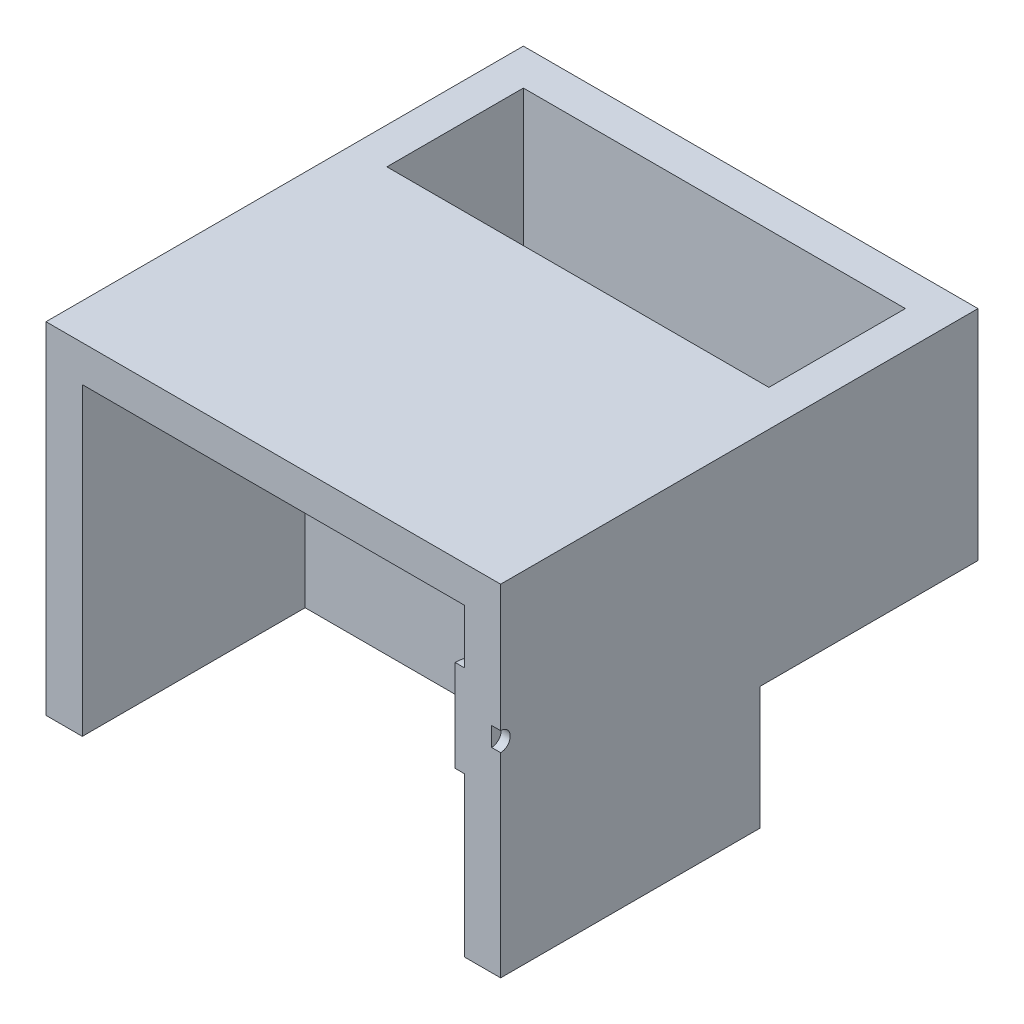
ISO-10303-21;
HEADER;
FILE_DESCRIPTION(('STEP AP214'),'2;1');
FILE_NAME('part.step','',(''),(''),'','','');
FILE_SCHEMA(('AUTOMOTIVE_DESIGN { 1 0 10303 214 1 1 1 1 }'));
ENDSEC;
DATA;
#1=APPLICATION_CONTEXT('core data for automotive mechanical design processes');
#2=APPLICATION_PROTOCOL_DEFINITION('international standard','automotive_design',2000,#1);
#3=PRODUCT_CONTEXT('',#1,'mechanical');
#4=PRODUCT('Part','Part','',(#3));
#5=PRODUCT_RELATED_PRODUCT_CATEGORY('part','',(#4));
#6=PRODUCT_DEFINITION_FORMATION('','',#4);
#7=PRODUCT_DEFINITION_CONTEXT('part definition',#1,'design');
#8=PRODUCT_DEFINITION('design','',#6,#7);
#9=PRODUCT_DEFINITION_SHAPE('','',#8);
#10=(LENGTH_UNIT() NAMED_UNIT(*) SI_UNIT(.MILLI.,.METRE.));
#11=(NAMED_UNIT(*) PLANE_ANGLE_UNIT() SI_UNIT($,.RADIAN.));
#12=(NAMED_UNIT(*) SI_UNIT($,.STERADIAN.) SOLID_ANGLE_UNIT());
#13=UNCERTAINTY_MEASURE_WITH_UNIT(LENGTH_MEASURE(1.E-05),#10,'distance_accuracy_value','');
#14=(GEOMETRIC_REPRESENTATION_CONTEXT(3) GLOBAL_UNCERTAINTY_ASSIGNED_CONTEXT((#13)) GLOBAL_UNIT_ASSIGNED_CONTEXT((#10,
#11,#12)) REPRESENTATION_CONTEXT('',''));
#15=CARTESIAN_POINT('',(0.,0.,0.));
#16=DIRECTION('',(0.,0.,1.));
#17=DIRECTION('',(1.,0.,0.));
#18=AXIS2_PLACEMENT_3D('',#15,#16,#17);
#19=CARTESIAN_POINT('',(20.,255.,0.));
#20=DIRECTION('',(0.,1.,0.));
#21=DIRECTION('',(0.,0.,1.));
#22=AXIS2_PLACEMENT_3D('',#19,#20,#21);
#23=PLANE('',#22);
#24=DIRECTION('',(-1.,0.,0.));
#25=VECTOR('',#24,1.);
#26=CARTESIAN_POINT('',(0.,255.,-105.));
#27=LINE('',#26,#25);
#28=CARTESIAN_POINT('',(20.,255.,-105.));
#29=VERTEX_POINT('',#28);
#30=CARTESIAN_POINT('',(-80.,255.,-105.));
#31=VERTEX_POINT('',#30);
#32=EDGE_CURVE('E202',#29,#31,#27,.T.);
#33=ORIENTED_EDGE('',*,*,#32,.T.);
#34=DIRECTION('',(0.,0.,1.));
#35=VECTOR('',#34,1.);
#36=CARTESIAN_POINT('',(-80.,255.,105.));
#37=LINE('',#36,#35);
#38=CARTESIAN_POINT('',(-80.,255.,0.));
#39=VERTEX_POINT('',#38);
#40=EDGE_CURVE('E228',#31,#39,#37,.T.);
#41=ORIENTED_EDGE('',*,*,#40,.T.);
#42=DIRECTION('',(-1.,0.,0.));
#43=VECTOR('',#42,1.);
#44=CARTESIAN_POINT('',(-105.,255.,0.));
#45=LINE('',#44,#43);
#46=CARTESIAN_POINT('',(20.,255.,0.));
#47=VERTEX_POINT('',#46);
#48=EDGE_CURVE('E11',#47,#39,#45,.T.);
#49=ORIENTED_EDGE('',*,*,#48,.F.);
#50=DIRECTION('',(0.,0.,1.));
#51=VECTOR('',#50,1.);
#52=CARTESIAN_POINT('',(20.,255.,105.));
#53=LINE('',#52,#51);
#54=EDGE_CURVE('E63',#29,#47,#53,.T.);
#55=ORIENTED_EDGE('',*,*,#54,.F.);
#56=EDGE_LOOP('',(#33,#41,#49,#55));
#57=FACE_BOUND('',#56,.T.);
#58=DIRECTION('',(1.,0.,0.));
#59=VECTOR('',#58,1.);
#60=CARTESIAN_POINT('',(-105.,255.,-66.99));
#61=LINE('',#60,#59);
#62=CARTESIAN_POINT('',(-72.01,255.,-66.99));
#63=VERTEX_POINT('',#62);
#64=CARTESIAN_POINT('',(12.01,255.,-66.99));
#65=VERTEX_POINT('',#64);
#66=EDGE_CURVE('E197',#63,#65,#61,.T.);
#67=ORIENTED_EDGE('',*,*,#66,.F.);
#68=DIRECTION('',(0.,0.,-1.));
#69=VECTOR('',#68,1.);
#70=CARTESIAN_POINT('',(-72.01,255.,105.));
#71=LINE('',#70,#69);
#72=CARTESIAN_POINT('',(-72.01,255.,-97.01));
#73=VERTEX_POINT('',#72);
#74=EDGE_CURVE('E179',#63,#73,#71,.T.);
#75=ORIENTED_EDGE('',*,*,#74,.T.);
#76=DIRECTION('',(-1.,0.,0.));
#77=VECTOR('',#76,1.);
#78=CARTESIAN_POINT('',(0.,255.,-97.01));
#79=LINE('',#78,#77);
#80=CARTESIAN_POINT('',(12.01,255.,-97.01));
#81=VERTEX_POINT('',#80);
#82=EDGE_CURVE('E190',#81,#73,#79,.T.);
#83=ORIENTED_EDGE('',*,*,#82,.F.);
#84=DIRECTION('',(0.,0.,-1.));
#85=VECTOR('',#84,1.);
#86=CARTESIAN_POINT('',(12.01,255.,105.));
#87=LINE('',#86,#85);
#88=EDGE_CURVE('E196',#65,#81,#87,.T.);
#89=ORIENTED_EDGE('',*,*,#88,.F.);
#90=EDGE_LOOP('',(#67,#75,#83,#89));
#91=FACE_BOUND('',#90,.T.);
#92=ADVANCED_FACE('F45',(#57,#91),#23,.T.);
#93=CARTESIAN_POINT('',(10.01,225.,0.));
#94=DIRECTION('',(1.,0.,0.));
#95=DIRECTION('',(0.,0.,-1.));
#96=AXIS2_PLACEMENT_3D('',#93,#94,#95);
#97=PLANE('',#96);
#98=DIRECTION('',(0.,-1.,0.));
#99=VECTOR('',#98,1.);
#100=CARTESIAN_POINT('',(10.01,225.,0.));
#101=LINE('',#100,#99);
#102=CARTESIAN_POINT('',(10.01,235.09,0.));
#103=VERTEX_POINT('',#102);
#104=CARTESIAN_POINT('',(10.01,214.91,0.));
#105=VERTEX_POINT('',#104);
#106=EDGE_CURVE('E328',#103,#105,#101,.T.);
#107=ORIENTED_EDGE('',*,*,#106,.F.);
#108=CARTESIAN_POINT('',(10.01,225.,0.));
#109=DIRECTION('',(1.,0.,0.));
#110=DIRECTION('',(0.,0.,-1.));
#111=AXIS2_PLACEMENT_3D('',#108,#109,#110);
#112=CIRCLE('',#111,10.09);
#113=EDGE_CURVE('E294',#105,#103,#112,.T.);
#114=ORIENTED_EDGE('',*,*,#113,.F.);
#115=EDGE_LOOP('',(#107,#114));
#116=FACE_BOUND('',#115,.T.);
#117=ADVANCED_FACE('F402',(#116),#97,.F.);
#118=CARTESIAN_POINT('',(18.,225.,0.));
#119=DIRECTION('',(1.,0.,0.));
#120=DIRECTION('',(0.,0.,-1.));
#121=AXIS2_PLACEMENT_3D('',#118,#119,#120);
#122=PLANE('',#121);
#123=CARTESIAN_POINT('',(18.,225.,0.));
#124=DIRECTION('',(1.,0.,0.));
#125=DIRECTION('',(0.,0.,-1.));
#126=AXIS2_PLACEMENT_3D('',#123,#124,#125);
#127=CIRCLE('',#126,2.1);
#128=CARTESIAN_POINT('',(18.,222.9,0.));
#129=VERTEX_POINT('',#128);
#130=CARTESIAN_POINT('',(18.,227.1,0.));
#131=VERTEX_POINT('',#130);
#132=EDGE_CURVE('E250',#129,#131,#127,.T.);
#133=ORIENTED_EDGE('',*,*,#132,.T.);
#134=DIRECTION('',(0.,-1.,0.));
#135=VECTOR('',#134,1.);
#136=CARTESIAN_POINT('',(18.,225.,0.));
#137=LINE('',#136,#135);
#138=EDGE_CURVE('E350',#131,#129,#137,.T.);
#139=ORIENTED_EDGE('',*,*,#138,.T.);
#140=EDGE_LOOP('',(#133,#139));
#141=FACE_BOUND('',#140,.T.);
#142=ADVANCED_FACE('F404',(#141),#122,.T.);
#143=CARTESIAN_POINT('',(18.,225.,0.));
#144=DIRECTION('',(1.,0.,0.));
#145=DIRECTION('',(0.,0.,-1.));
#146=AXIS2_PLACEMENT_3D('',#143,#144,#145);
#147=CYLINDRICAL_SURFACE('',#146,2.1);
#148=DIRECTION('',(1.,0.,0.));
#149=VECTOR('',#148,1.);
#150=CARTESIAN_POINT('',(18.,222.9,0.));
#151=LINE('',#150,#149);
#152=CARTESIAN_POINT('',(20.,222.9,0.));
#153=VERTEX_POINT('',#152);
#154=EDGE_CURVE('E320',#153,#129,#151,.F.);
#155=ORIENTED_EDGE('',*,*,#154,.F.);
#156=CARTESIAN_POINT('',(20.,225.,0.));
#157=DIRECTION('',(1.,0.,0.));
#158=DIRECTION('',(0.,0.,-1.));
#159=AXIS2_PLACEMENT_3D('',#156,#157,#158);
#160=CIRCLE('',#159,2.1);
#161=CARTESIAN_POINT('',(20.,227.1,0.));
#162=VERTEX_POINT('',#161);
#163=EDGE_CURVE('E71',#153,#162,#160,.T.);
#164=ORIENTED_EDGE('',*,*,#163,.T.);
#165=DIRECTION('',(1.,0.,0.));
#166=VECTOR('',#165,1.);
#167=CARTESIAN_POINT('',(18.,227.1,0.));
#168=LINE('',#167,#166);
#169=EDGE_CURVE('E317',#131,#162,#168,.T.);
#170=ORIENTED_EDGE('',*,*,#169,.F.);
#171=ORIENTED_EDGE('',*,*,#132,.F.);
#172=EDGE_LOOP('',(#155,#164,#170,#171));
#173=FACE_BOUND('',#172,.T.);
#174=ADVANCED_FACE('F410',(#173),#147,.F.);
#175=CARTESIAN_POINT('',(-105.,247.01,59.));
#176=DIRECTION('',(0.,-1.,0.));
#177=DIRECTION('',(0.,0.,-1.));
#178=AXIS2_PLACEMENT_3D('',#175,#176,#177);
#179=PLANE('',#178);
#180=DIRECTION('',(0.,0.,1.));
#181=VECTOR('',#180,1.);
#182=CARTESIAN_POINT('',(12.01,247.01,105.));
#183=LINE('',#182,#181);
#184=CARTESIAN_POINT('',(12.01,247.01,-66.99));
#185=VERTEX_POINT('',#184);
#186=CARTESIAN_POINT('',(12.01,247.01,0.));
#187=VERTEX_POINT('',#186);
#188=EDGE_CURVE('E267',#185,#187,#183,.T.);
#189=ORIENTED_EDGE('',*,*,#188,.T.);
#190=DIRECTION('',(-1.,0.,0.));
#191=VECTOR('',#190,1.);
#192=CARTESIAN_POINT('',(-105.,247.01,0.));
#193=LINE('',#192,#191);
#194=CARTESIAN_POINT('',(-72.01,247.01,0.));
#195=VERTEX_POINT('',#194);
#196=EDGE_CURVE('E344',#187,#195,#193,.T.);
#197=ORIENTED_EDGE('',*,*,#196,.T.);
#198=DIRECTION('',(0.,0.,1.));
#199=VECTOR('',#198,1.);
#200=CARTESIAN_POINT('',(-72.01,247.01,105.));
#201=LINE('',#200,#199);
#202=CARTESIAN_POINT('',(-72.01,247.01,-66.99));
#203=VERTEX_POINT('',#202);
#204=EDGE_CURVE('E211',#203,#195,#201,.T.);
#205=ORIENTED_EDGE('',*,*,#204,.F.);
#206=DIRECTION('',(1.,0.,0.));
#207=VECTOR('',#206,1.);
#208=CARTESIAN_POINT('',(-105.,247.01,-66.99));
#209=LINE('',#208,#207);
#210=EDGE_CURVE('E212',#203,#185,#209,.T.);
#211=ORIENTED_EDGE('',*,*,#210,.T.);
#212=EDGE_LOOP('',(#189,#197,#205,#211));
#213=FACE_BOUND('',#212,.T.);
#214=ADVANCED_FACE('F290',(#213),#179,.T.);
#215=CARTESIAN_POINT('',(18.,225.,0.));
#216=DIRECTION('',(1.,0.,0.));
#217=DIRECTION('',(0.,0.,-1.));
#218=AXIS2_PLACEMENT_3D('',#215,#216,#217);
#219=CYLINDRICAL_SURFACE('',#218,10.09);
#220=CARTESIAN_POINT('',(12.01,225.,0.));
#221=DIRECTION('',(-1.,0.,0.));
#222=DIRECTION('',(0.,0.,1.));
#223=AXIS2_PLACEMENT_3D('',#220,#221,#222);
#224=CIRCLE('',#223,10.09);
#225=CARTESIAN_POINT('',(12.01,214.91,0.));
#226=VERTEX_POINT('',#225);
#227=CARTESIAN_POINT('',(12.01,235.09,0.));
#228=VERTEX_POINT('',#227);
#229=EDGE_CURVE('E292',#226,#228,#224,.F.);
#230=ORIENTED_EDGE('',*,*,#229,.F.);
#231=DIRECTION('',(1.,0.,0.));
#232=VECTOR('',#231,1.);
#233=CARTESIAN_POINT('',(18.,214.91,0.));
#234=LINE('',#233,#232);
#235=EDGE_CURVE('E337',#226,#105,#234,.F.);
#236=ORIENTED_EDGE('',*,*,#235,.T.);
#237=ORIENTED_EDGE('',*,*,#113,.T.);
#238=DIRECTION('',(1.,0.,0.));
#239=VECTOR('',#238,1.);
#240=CARTESIAN_POINT('',(18.,235.09,0.));
#241=LINE('',#240,#239);
#242=EDGE_CURVE('E340',#103,#228,#241,.T.);
#243=ORIENTED_EDGE('',*,*,#242,.T.);
#244=EDGE_LOOP('',(#230,#236,#237,#243));
#245=FACE_BOUND('',#244,.T.);
#246=ADVANCED_FACE('F398',(#245),#219,.T.);
#247=CARTESIAN_POINT('',(0.,0.,0.));
#248=DIRECTION('',(0.,0.,1.));
#249=DIRECTION('',(1.,0.,0.));
#250=AXIS2_PLACEMENT_3D('',#247,#248,#249);
#251=PLANE('',#250);
#252=ORIENTED_EDGE('',*,*,#235,.F.);
#253=DIRECTION('',(0.,1.,0.));
#254=VECTOR('',#253,1.);
#255=CARTESIAN_POINT('',(12.01,0.,0.));
#256=LINE('',#255,#254);
#257=CARTESIAN_POINT('',(12.01,180.,0.));
#258=VERTEX_POINT('',#257);
#259=EDGE_CURVE('E347',#258,#226,#256,.T.);
#260=ORIENTED_EDGE('',*,*,#259,.F.);
#261=DIRECTION('',(1.,0.,0.));
#262=VECTOR('',#261,1.);
#263=CARTESIAN_POINT('',(0.,180.,0.));
#264=LINE('',#263,#262);
#265=CARTESIAN_POINT('',(20.,180.,0.));
#266=VERTEX_POINT('',#265);
#267=EDGE_CURVE('E332',#258,#266,#264,.T.);
#268=ORIENTED_EDGE('',*,*,#267,.T.);
#269=DIRECTION('',(0.,1.,0.));
#270=VECTOR('',#269,1.);
#271=CARTESIAN_POINT('',(20.,0.,0.));
#272=LINE('',#271,#270);
#273=EDGE_CURVE('E316',#266,#153,#272,.T.);
#274=ORIENTED_EDGE('',*,*,#273,.T.);
#275=ORIENTED_EDGE('',*,*,#154,.T.);
#276=ORIENTED_EDGE('',*,*,#138,.F.);
#277=ORIENTED_EDGE('',*,*,#169,.T.);
#278=EDGE_CURVE('E55',#162,#47,#272,.T.);
#279=ORIENTED_EDGE('',*,*,#278,.T.);
#280=ORIENTED_EDGE('',*,*,#48,.T.);
#281=DIRECTION('',(0.,1.,0.));
#282=VECTOR('',#281,1.);
#283=CARTESIAN_POINT('',(-80.,0.,0.));
#284=LINE('',#283,#282);
#285=CARTESIAN_POINT('',(-80.,180.,0.));
#286=VERTEX_POINT('',#285);
#287=EDGE_CURVE('E312',#286,#39,#284,.T.);
#288=ORIENTED_EDGE('',*,*,#287,.F.);
#289=CARTESIAN_POINT('',(-72.01,180.,0.));
#290=VERTEX_POINT('',#289);
#291=EDGE_CURVE('E336',#286,#290,#264,.T.);
#292=ORIENTED_EDGE('',*,*,#291,.T.);
#293=DIRECTION('',(0.,1.,0.));
#294=VECTOR('',#293,1.);
#295=CARTESIAN_POINT('',(-72.01,0.,0.));
#296=LINE('',#295,#294);
#297=EDGE_CURVE('E324',#290,#195,#296,.T.);
#298=ORIENTED_EDGE('',*,*,#297,.T.);
#299=ORIENTED_EDGE('',*,*,#196,.F.);
#300=EDGE_CURVE('E283',#228,#187,#256,.T.);
#301=ORIENTED_EDGE('',*,*,#300,.F.);
#302=ORIENTED_EDGE('',*,*,#242,.F.);
#303=ORIENTED_EDGE('',*,*,#106,.T.);
#304=EDGE_LOOP('',(#252,#260,#268,#274,#275,#276,#277,#279,#280,#288,#292,#298,#299,#301,#302,#303));
#305=FACE_BOUND('',#304,.T.);
#306=ADVANCED_FACE('F391',(#305),#251,.T.);
#307=CARTESIAN_POINT('',(0.,180.,0.));
#308=DIRECTION('',(0.,1.,0.));
#309=DIRECTION('',(0.,0.,1.));
#310=AXIS2_PLACEMENT_3D('',#307,#308,#309);
#311=PLANE('',#310);
#312=ORIENTED_EDGE('',*,*,#291,.F.);
#313=DIRECTION('',(0.,0.,-1.));
#314=VECTOR('',#313,1.);
#315=CARTESIAN_POINT('',(-80.,180.,105.));
#316=LINE('',#315,#314);
#317=CARTESIAN_POINT('',(-80.,180.,-57.));
#318=VERTEX_POINT('',#317);
#319=EDGE_CURVE('E378',#286,#318,#316,.T.);
#320=ORIENTED_EDGE('',*,*,#319,.T.);
#321=DIRECTION('',(-1.,0.,0.));
#322=VECTOR('',#321,1.);
#323=CARTESIAN_POINT('',(-105.,180.,-57.));
#324=LINE('',#323,#322);
#325=CARTESIAN_POINT('',(20.,180.,-57.));
#326=VERTEX_POINT('',#325);
#327=EDGE_CURVE('E251',#326,#318,#324,.T.);
#328=ORIENTED_EDGE('',*,*,#327,.F.);
#329=DIRECTION('',(0.,0.,-1.));
#330=VECTOR('',#329,1.);
#331=CARTESIAN_POINT('',(20.,180.,105.));
#332=LINE('',#331,#330);
#333=EDGE_CURVE('E256',#266,#326,#332,.T.);
#334=ORIENTED_EDGE('',*,*,#333,.F.);
#335=ORIENTED_EDGE('',*,*,#267,.F.);
#336=DIRECTION('',(0.,0.,-1.));
#337=VECTOR('',#336,1.);
#338=CARTESIAN_POINT('',(12.01,180.,105.));
#339=LINE('',#338,#337);
#340=CARTESIAN_POINT('',(12.01,180.,-49.01));
#341=VERTEX_POINT('',#340);
#342=EDGE_CURVE('E261',#258,#341,#339,.T.);
#343=ORIENTED_EDGE('',*,*,#342,.T.);
#344=DIRECTION('',(-1.,0.,0.));
#345=VECTOR('',#344,1.);
#346=CARTESIAN_POINT('',(-105.,180.,-49.01));
#347=LINE('',#346,#345);
#348=CARTESIAN_POINT('',(-72.01,180.,-49.01));
#349=VERTEX_POINT('',#348);
#350=EDGE_CURVE('E257',#341,#349,#347,.T.);
#351=ORIENTED_EDGE('',*,*,#350,.T.);
#352=DIRECTION('',(0.,0.,-1.));
#353=VECTOR('',#352,1.);
#354=CARTESIAN_POINT('',(-72.01,180.,105.));
#355=LINE('',#354,#353);
#356=EDGE_CURVE('E255',#290,#349,#355,.T.);
#357=ORIENTED_EDGE('',*,*,#356,.F.);
#358=EDGE_LOOP('',(#312,#320,#328,#334,#335,#343,#351,#357));
#359=FACE_BOUND('',#358,.T.);
#360=ADVANCED_FACE('F388',(#359),#311,.F.);
#361=CARTESIAN_POINT('',(-105.,207.,-49.01));
#362=DIRECTION('',(0.,0.,1.));
#363=DIRECTION('',(0.,-1.,0.));
#364=AXIS2_PLACEMENT_3D('',#361,#362,#363);
#365=PLANE('',#364);
#366=ORIENTED_EDGE('',*,*,#350,.F.);
#367=DIRECTION('',(0.,1.,0.));
#368=VECTOR('',#367,1.);
#369=CARTESIAN_POINT('',(12.01,0.,-49.01));
#370=LINE('',#369,#368);
#371=CARTESIAN_POINT('',(12.01,214.99,-49.01));
#372=VERTEX_POINT('',#371);
#373=EDGE_CURVE('E264',#341,#372,#370,.T.);
#374=ORIENTED_EDGE('',*,*,#373,.T.);
#375=DIRECTION('',(1.,0.,0.));
#376=VECTOR('',#375,1.);
#377=CARTESIAN_POINT('',(-105.,214.99,-49.01));
#378=LINE('',#377,#376);
#379=CARTESIAN_POINT('',(-72.01,214.99,-49.01));
#380=VERTEX_POINT('',#379);
#381=EDGE_CURVE('E270',#380,#372,#378,.T.);
#382=ORIENTED_EDGE('',*,*,#381,.F.);
#383=DIRECTION('',(0.,1.,0.));
#384=VECTOR('',#383,1.);
#385=CARTESIAN_POINT('',(-72.01,0.,-49.01));
#386=LINE('',#385,#384);
#387=EDGE_CURVE('E186',#349,#380,#386,.T.);
#388=ORIENTED_EDGE('',*,*,#387,.F.);
#389=EDGE_LOOP('',(#366,#374,#382,#388));
#390=FACE_BOUND('',#389,.T.);
#391=ADVANCED_FACE('F371',(#390),#365,.T.);
#392=CARTESIAN_POINT('',(-105.,214.99,-105.));
#393=DIRECTION('',(0.,1.,0.));
#394=DIRECTION('',(0.,0.,1.));
#395=AXIS2_PLACEMENT_3D('',#392,#393,#394);
#396=PLANE('',#395);
#397=DIRECTION('',(0.,0.,-1.));
#398=VECTOR('',#397,1.);
#399=CARTESIAN_POINT('',(-72.01,214.99,105.));
#400=LINE('',#399,#398);
#401=CARTESIAN_POINT('',(-72.01,214.99,-97.01));
#402=VERTEX_POINT('',#401);
#403=EDGE_CURVE('E181',#380,#402,#400,.T.);
#404=ORIENTED_EDGE('',*,*,#403,.F.);
#405=ORIENTED_EDGE('',*,*,#381,.T.);
#406=DIRECTION('',(0.,0.,-1.));
#407=VECTOR('',#406,1.);
#408=CARTESIAN_POINT('',(12.01,214.99,105.));
#409=LINE('',#408,#407);
#410=CARTESIAN_POINT('',(12.01,214.99,-97.01));
#411=VERTEX_POINT('',#410);
#412=EDGE_CURVE('E218',#372,#411,#409,.T.);
#413=ORIENTED_EDGE('',*,*,#412,.T.);
#414=DIRECTION('',(-1.,0.,0.));
#415=VECTOR('',#414,1.);
#416=CARTESIAN_POINT('',(0.,214.99,-97.01));
#417=LINE('',#416,#415);
#418=EDGE_CURVE('E185',#411,#402,#417,.T.);
#419=ORIENTED_EDGE('',*,*,#418,.T.);
#420=EDGE_LOOP('',(#404,#405,#413,#419));
#421=FACE_BOUND('',#420,.T.);
#422=ADVANCED_FACE('F366',(#421),#396,.T.);
#423=CARTESIAN_POINT('',(0.,0.,-97.01));
#424=DIRECTION('',(0.,0.,1.));
#425=DIRECTION('',(1.,0.,0.));
#426=AXIS2_PLACEMENT_3D('',#423,#424,#425);
#427=PLANE('',#426);
#428=DIRECTION('',(0.,1.,0.));
#429=VECTOR('',#428,1.);
#430=CARTESIAN_POINT('',(12.01,0.,-97.01));
#431=LINE('',#430,#429);
#432=EDGE_CURVE('E193',#411,#81,#431,.T.);
#433=ORIENTED_EDGE('',*,*,#432,.T.);
#434=ORIENTED_EDGE('',*,*,#82,.T.);
#435=DIRECTION('',(0.,1.,0.));
#436=VECTOR('',#435,1.);
#437=CARTESIAN_POINT('',(-72.01,0.,-97.01));
#438=LINE('',#437,#436);
#439=EDGE_CURVE('E175',#402,#73,#438,.T.);
#440=ORIENTED_EDGE('',*,*,#439,.F.);
#441=ORIENTED_EDGE('',*,*,#418,.F.);
#442=EDGE_LOOP('',(#433,#434,#440,#441));
#443=FACE_BOUND('',#442,.T.);
#444=ADVANCED_FACE('F191',(#443),#427,.T.);
#445=CARTESIAN_POINT('',(-105.,520.,-66.99));
#446=DIRECTION('',(0.,0.,-1.));
#447=DIRECTION('',(0.,1.,0.));
#448=AXIS2_PLACEMENT_3D('',#445,#446,#447);
#449=PLANE('',#448);
#450=DIRECTION('',(0.,-1.,0.));
#451=VECTOR('',#450,1.);
#452=CARTESIAN_POINT('',(-72.01,0.,-66.99));
#453=LINE('',#452,#451);
#454=EDGE_CURVE('E209',#63,#203,#453,.T.);
#455=ORIENTED_EDGE('',*,*,#454,.F.);
#456=ORIENTED_EDGE('',*,*,#66,.T.);
#457=DIRECTION('',(0.,-1.,0.));
#458=VECTOR('',#457,1.);
#459=CARTESIAN_POINT('',(12.01,0.,-66.99));
#460=LINE('',#459,#458);
#461=EDGE_CURVE('E214',#65,#185,#460,.T.);
#462=ORIENTED_EDGE('',*,*,#461,.T.);
#463=ORIENTED_EDGE('',*,*,#210,.F.);
#464=EDGE_LOOP('',(#455,#456,#462,#463));
#465=FACE_BOUND('',#464,.T.);
#466=ADVANCED_FACE('F275',(#465),#449,.T.);
#467=CARTESIAN_POINT('',(12.01,0.,105.));
#468=DIRECTION('',(-1.,0.,0.));
#469=DIRECTION('',(0.,0.,1.));
#470=AXIS2_PLACEMENT_3D('',#467,#468,#469);
#471=PLANE('',#470);
#472=ORIENTED_EDGE('',*,*,#461,.F.);
#473=ORIENTED_EDGE('',*,*,#88,.T.);
#474=ORIENTED_EDGE('',*,*,#432,.F.);
#475=ORIENTED_EDGE('',*,*,#412,.F.);
#476=ORIENTED_EDGE('',*,*,#373,.F.);
#477=ORIENTED_EDGE('',*,*,#342,.F.);
#478=ORIENTED_EDGE('',*,*,#259,.T.);
#479=ORIENTED_EDGE('',*,*,#229,.T.);
#480=ORIENTED_EDGE('',*,*,#300,.T.);
#481=ORIENTED_EDGE('',*,*,#188,.F.);
#482=EDGE_LOOP('',(#472,#473,#474,#475,#476,#477,#478,#479,#480,#481));
#483=FACE_BOUND('',#482,.T.);
#484=ADVANCED_FACE('F279',(#483),#471,.T.);
#485=CARTESIAN_POINT('',(-72.01,0.,105.));
#486=DIRECTION('',(-1.,0.,0.));
#487=DIRECTION('',(0.,0.,1.));
#488=AXIS2_PLACEMENT_3D('',#485,#486,#487);
#489=PLANE('',#488);
#490=ORIENTED_EDGE('',*,*,#74,.F.);
#491=ORIENTED_EDGE('',*,*,#454,.T.);
#492=ORIENTED_EDGE('',*,*,#204,.T.);
#493=ORIENTED_EDGE('',*,*,#297,.F.);
#494=ORIENTED_EDGE('',*,*,#356,.T.);
#495=ORIENTED_EDGE('',*,*,#387,.T.);
#496=ORIENTED_EDGE('',*,*,#403,.T.);
#497=ORIENTED_EDGE('',*,*,#439,.T.);
#498=EDGE_LOOP('',(#490,#491,#492,#493,#494,#495,#496,#497));
#499=FACE_BOUND('',#498,.T.);
#500=ADVANCED_FACE('F177',(#499),#489,.F.);
#501=CARTESIAN_POINT('',(-105.,207.,-57.));
#502=DIRECTION('',(0.,0.,1.));
#503=DIRECTION('',(0.,-1.,0.));
#504=AXIS2_PLACEMENT_3D('',#501,#502,#503);
#505=PLANE('',#504);
#506=DIRECTION('',(0.,1.,0.));
#507=VECTOR('',#506,1.);
#508=CARTESIAN_POINT('',(20.,0.,-57.));
#509=LINE('',#508,#507);
#510=CARTESIAN_POINT('',(20.,207.,-57.));
#511=VERTEX_POINT('',#510);
#512=EDGE_CURVE('E230',#326,#511,#509,.T.);
#513=ORIENTED_EDGE('',*,*,#512,.F.);
#514=ORIENTED_EDGE('',*,*,#327,.T.);
#515=DIRECTION('',(0.,1.,0.));
#516=VECTOR('',#515,1.);
#517=CARTESIAN_POINT('',(-80.,0.,-57.));
#518=LINE('',#517,#516);
#519=CARTESIAN_POINT('',(-80.,207.,-57.));
#520=VERTEX_POINT('',#519);
#521=EDGE_CURVE('E243',#318,#520,#518,.T.);
#522=ORIENTED_EDGE('',*,*,#521,.T.);
#523=DIRECTION('',(1.,0.,0.));
#524=VECTOR('',#523,1.);
#525=CARTESIAN_POINT('',(-105.,207.,-57.));
#526=LINE('',#525,#524);
#527=EDGE_CURVE('E246',#520,#511,#526,.T.);
#528=ORIENTED_EDGE('',*,*,#527,.T.);
#529=EDGE_LOOP('',(#513,#514,#522,#528));
#530=FACE_BOUND('',#529,.T.);
#531=ADVANCED_FACE('F439',(#530),#505,.F.);
#532=CARTESIAN_POINT('',(-105.,207.,-105.));
#533=DIRECTION('',(0.,1.,0.));
#534=DIRECTION('',(0.,0.,1.));
#535=AXIS2_PLACEMENT_3D('',#532,#533,#534);
#536=PLANE('',#535);
#537=DIRECTION('',(0.,0.,-1.));
#538=VECTOR('',#537,1.);
#539=CARTESIAN_POINT('',(-80.,207.,105.));
#540=LINE('',#539,#538);
#541=CARTESIAN_POINT('',(-80.,207.,-105.));
#542=VERTEX_POINT('',#541);
#543=EDGE_CURVE('E239',#520,#542,#540,.T.);
#544=ORIENTED_EDGE('',*,*,#543,.T.);
#545=DIRECTION('',(-1.,0.,0.));
#546=VECTOR('',#545,1.);
#547=CARTESIAN_POINT('',(0.,207.,-105.));
#548=LINE('',#547,#546);
#549=CARTESIAN_POINT('',(20.,207.,-105.));
#550=VERTEX_POINT('',#549);
#551=EDGE_CURVE('E221',#550,#542,#548,.T.);
#552=ORIENTED_EDGE('',*,*,#551,.F.);
#553=DIRECTION('',(0.,0.,-1.));
#554=VECTOR('',#553,1.);
#555=CARTESIAN_POINT('',(20.,207.,105.));
#556=LINE('',#555,#554);
#557=EDGE_CURVE('E242',#511,#550,#556,.T.);
#558=ORIENTED_EDGE('',*,*,#557,.F.);
#559=ORIENTED_EDGE('',*,*,#527,.F.);
#560=EDGE_LOOP('',(#544,#552,#558,#559));
#561=FACE_BOUND('',#560,.T.);
#562=ADVANCED_FACE('F443',(#561),#536,.F.);
#563=CARTESIAN_POINT('',(0.,0.,-105.));
#564=DIRECTION('',(0.,0.,1.));
#565=DIRECTION('',(1.,0.,0.));
#566=AXIS2_PLACEMENT_3D('',#563,#564,#565);
#567=PLANE('',#566);
#568=ORIENTED_EDGE('',*,*,#32,.F.);
#569=DIRECTION('',(0.,1.,0.));
#570=VECTOR('',#569,1.);
#571=CARTESIAN_POINT('',(20.,0.,-105.));
#572=LINE('',#571,#570);
#573=EDGE_CURVE('E219',#550,#29,#572,.T.);
#574=ORIENTED_EDGE('',*,*,#573,.F.);
#575=ORIENTED_EDGE('',*,*,#551,.T.);
#576=DIRECTION('',(0.,1.,0.));
#577=VECTOR('',#576,1.);
#578=CARTESIAN_POINT('',(-80.,0.,-105.));
#579=LINE('',#578,#577);
#580=EDGE_CURVE('E49',#542,#31,#579,.T.);
#581=ORIENTED_EDGE('',*,*,#580,.T.);
#582=EDGE_LOOP('',(#568,#574,#575,#581));
#583=FACE_BOUND('',#582,.T.);
#584=ADVANCED_FACE('F444',(#583),#567,.F.);
#585=CARTESIAN_POINT('',(-80.,0.,105.));
#586=DIRECTION('',(-1.,0.,0.));
#587=DIRECTION('',(0.,0.,1.));
#588=AXIS2_PLACEMENT_3D('',#585,#586,#587);
#589=PLANE('',#588);
#590=ORIENTED_EDGE('',*,*,#40,.F.);
#591=ORIENTED_EDGE('',*,*,#580,.F.);
#592=ORIENTED_EDGE('',*,*,#543,.F.);
#593=ORIENTED_EDGE('',*,*,#521,.F.);
#594=ORIENTED_EDGE('',*,*,#319,.F.);
#595=ORIENTED_EDGE('',*,*,#287,.T.);
#596=EDGE_LOOP('',(#590,#591,#592,#593,#594,#595));
#597=FACE_BOUND('',#596,.T.);
#598=ADVANCED_FACE('F47',(#597),#589,.T.);
#599=CARTESIAN_POINT('',(20.,0.,105.));
#600=DIRECTION('',(-1.,0.,0.));
#601=DIRECTION('',(0.,0.,1.));
#602=AXIS2_PLACEMENT_3D('',#599,#600,#601);
#603=PLANE('',#602);
#604=ORIENTED_EDGE('',*,*,#573,.T.);
#605=ORIENTED_EDGE('',*,*,#54,.T.);
#606=ORIENTED_EDGE('',*,*,#278,.F.);
#607=ORIENTED_EDGE('',*,*,#163,.F.);
#608=ORIENTED_EDGE('',*,*,#273,.F.);
#609=ORIENTED_EDGE('',*,*,#333,.T.);
#610=ORIENTED_EDGE('',*,*,#512,.T.);
#611=ORIENTED_EDGE('',*,*,#557,.T.);
#612=EDGE_LOOP('',(#604,#605,#606,#607,#608,#609,#610,#611));
#613=FACE_BOUND('',#612,.T.);
#614=ADVANCED_FACE('F415',(#613),#603,.F.);
#615=CLOSED_SHELL('',(#92,#117,#142,#174,#214,#246,#306,#360,#391,#422,#444,#466,#484,#500,#531,
#562,#584,#598,#614));
#616=MANIFOLD_SOLID_BREP('B2',#615);
#617=ADVANCED_BREP_SHAPE_REPRESENTATION('',(#18,#616),#14);
#618=SHAPE_DEFINITION_REPRESENTATION(#9,#617);
ENDSEC;
END-ISO-10303-21;
